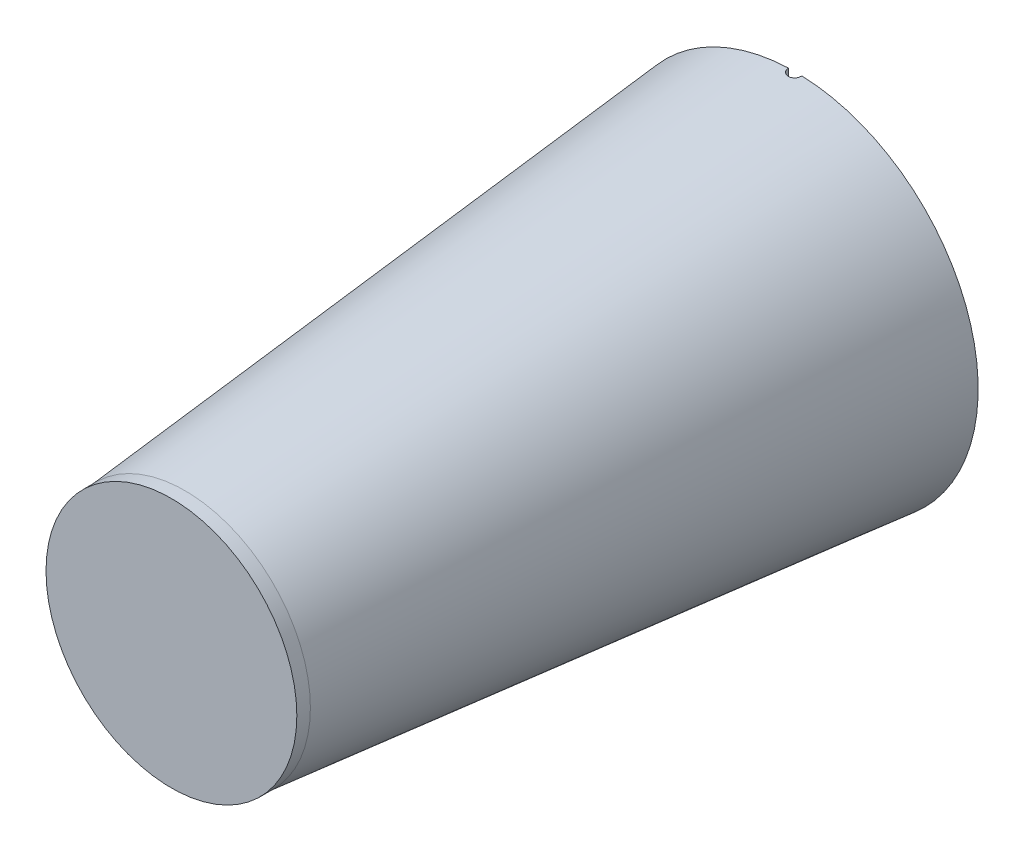
ISO-10303-21;
HEADER;
FILE_DESCRIPTION(('STEP AP214'),'2;1');
FILE_NAME('part.step','',(''),(''),'','','');
FILE_SCHEMA(('AUTOMOTIVE_DESIGN { 1 0 10303 214 1 1 1 1 }'));
ENDSEC;
DATA;
#1=APPLICATION_CONTEXT('core data for automotive mechanical design processes');
#2=APPLICATION_PROTOCOL_DEFINITION('international standard','automotive_design',2000,#1);
#3=PRODUCT_CONTEXT('',#1,'mechanical');
#4=PRODUCT('Part','Part','',(#3));
#5=PRODUCT_RELATED_PRODUCT_CATEGORY('part','',(#4));
#6=PRODUCT_DEFINITION_FORMATION('','',#4);
#7=PRODUCT_DEFINITION_CONTEXT('part definition',#1,'design');
#8=PRODUCT_DEFINITION('design','',#6,#7);
#9=PRODUCT_DEFINITION_SHAPE('','',#8);
#10=(LENGTH_UNIT() NAMED_UNIT(*) SI_UNIT(.MILLI.,.METRE.));
#11=(NAMED_UNIT(*) PLANE_ANGLE_UNIT() SI_UNIT($,.RADIAN.));
#12=(NAMED_UNIT(*) SI_UNIT($,.STERADIAN.) SOLID_ANGLE_UNIT());
#13=UNCERTAINTY_MEASURE_WITH_UNIT(LENGTH_MEASURE(1.E-05),#10,'distance_accuracy_value','');
#14=(GEOMETRIC_REPRESENTATION_CONTEXT(3) GLOBAL_UNCERTAINTY_ASSIGNED_CONTEXT((#13)) GLOBAL_UNIT_ASSIGNED_CONTEXT((#10,
#11,#12)) REPRESENTATION_CONTEXT('',''));
#15=CARTESIAN_POINT('',(0.,0.,0.));
#16=DIRECTION('',(0.,0.,1.));
#17=DIRECTION('',(1.,0.,0.));
#18=AXIS2_PLACEMENT_3D('',#15,#16,#17);
#19=CARTESIAN_POINT('',(0.,0.,-142.875));
#20=DIRECTION('',(0.,0.,-1.));
#21=DIRECTION('',(-1.,0.,0.));
#22=AXIS2_PLACEMENT_3D('',#19,#20,#21);
#23=PLANE('',#22);
#24=DIRECTION('',(0.,1.,0.));
#25=VECTOR('',#24,1.);
#26=CARTESIAN_POINT('',(-1.5875,-42.8625,-142.875));
#27=LINE('',#26,#25);
#28=CARTESIAN_POINT('',(-1.5875,-42.8330917632617,-142.875));
#29=VERTEX_POINT('',#28);
#30=CARTESIAN_POINT('',(-1.5875,-39.6415972973723,-142.875));
#31=VERTEX_POINT('',#30);
#32=EDGE_CURVE('E67',#29,#31,#27,.T.);
#33=ORIENTED_EDGE('',*,*,#32,.F.);
#34=CARTESIAN_POINT('',(0.,0.,-142.875));
#35=DIRECTION('',(0.,0.,1.));
#36=DIRECTION('',(1.,0.,0.));
#37=AXIS2_PLACEMENT_3D('',#34,#35,#36);
#38=CIRCLE('',#37,42.8625);
#39=CARTESIAN_POINT('',(-1.5875,42.8330917632617,-142.875));
#40=VERTEX_POINT('',#39);
#41=EDGE_CURVE('E110',#40,#29,#38,.T.);
#42=ORIENTED_EDGE('',*,*,#41,.F.);
#43=CARTESIAN_POINT('',(-1.5875,39.6415972973723,-142.875));
#44=VERTEX_POINT('',#43);
#45=EDGE_CURVE('E159',#44,#40,#27,.T.);
#46=ORIENTED_EDGE('',*,*,#45,.F.);
#47=CARTESIAN_POINT('',(0.,0.,-142.875));
#48=DIRECTION('',(0.,0.,-1.));
#49=DIRECTION('',(-1.,0.,0.));
#50=AXIS2_PLACEMENT_3D('',#47,#48,#49);
#51=CIRCLE('',#50,39.6733713280965);
#52=EDGE_CURVE('E101',#44,#31,#51,.F.);
#53=ORIENTED_EDGE('',*,*,#52,.T.);
#54=EDGE_LOOP('',(#33,#42,#46,#53));
#55=FACE_BOUND('',#54,.T.);
#56=ADVANCED_FACE('F39',(#55),#23,.T.);
#57=DIRECTION('',(0.,1.,0.));
#58=VECTOR('',#57,1.);
#59=CARTESIAN_POINT('',(1.5875,-42.8625,-142.875));
#60=LINE('',#59,#58);
#61=CARTESIAN_POINT('',(1.5875,42.8330917632617,-142.875));
#62=VERTEX_POINT('',#61);
#63=CARTESIAN_POINT('',(1.5875,39.6415972973723,-142.875));
#64=VERTEX_POINT('',#63);
#65=EDGE_CURVE('E60',#62,#64,#60,.F.);
#66=ORIENTED_EDGE('',*,*,#65,.F.);
#67=CARTESIAN_POINT('',(1.5875,-42.8330917632617,-142.875));
#68=VERTEX_POINT('',#67);
#69=EDGE_CURVE('E97',#68,#62,#38,.T.);
#70=ORIENTED_EDGE('',*,*,#69,.F.);
#71=CARTESIAN_POINT('',(1.5875,-39.6415972973723,-142.875));
#72=VERTEX_POINT('',#71);
#73=EDGE_CURVE('E84',#72,#68,#60,.F.);
#74=ORIENTED_EDGE('',*,*,#73,.F.);
#75=EDGE_CURVE('E95',#72,#64,#51,.F.);
#76=ORIENTED_EDGE('',*,*,#75,.T.);
#77=EDGE_LOOP('',(#66,#70,#74,#76));
#78=FACE_BOUND('',#77,.T.);
#79=ADVANCED_FACE('F94',(#78),#23,.T.);
#80=CARTESIAN_POINT('',(0.,0.,0.));
#81=DIRECTION('',(0.,0.,-1.));
#82=DIRECTION('',(-1.,0.,0.));
#83=AXIS2_PLACEMENT_3D('',#80,#81,#82);
#84=CONICAL_SURFACE('',#83,29.36875,0.0941651307315086);
#85=CARTESIAN_POINT('',(-1.58749998740157,42.8331106655862,-142.8752));
#86=CARTESIAN_POINT('',(-1.58750523012774,42.828886357014,-142.830509050695));
#87=CARTESIAN_POINT('',(-1.58562285524748,42.8247342089892,-142.785832351019));
#88=CARTESIAN_POINT('',(-1.57809810955712,42.8165963693619,-142.696782801359));
#89=CARTESIAN_POINT('',(-1.57245584084219,42.8126106732426,-142.652409943157));
#90=CARTESIAN_POINT('',(-1.54993374150302,42.8009474368018,-142.520284629854));
#91=CARTESIAN_POINT('',(-1.52745852880976,42.7935513421478,-142.433393939297));
#92=CARTESIAN_POINT('',(-1.46817652976476,42.7796714141653,-142.264562520417));
#93=CARTESIAN_POINT('',(-1.43136165872251,42.7731880982733,-142.182624614629));
#94=CARTESIAN_POINT('',(-1.34442773735409,42.7612157528768,-142.026071316838));
#95=CARTESIAN_POINT('',(-1.29431204429397,42.7557264730546,-141.951454083522));
#96=CARTESIAN_POINT('',(-1.18234109365005,42.7457825301732,-141.811886840149));
#97=CARTESIAN_POINT('',(-1.12051872117554,42.7413250448499,-141.74691063829));
#98=CARTESIAN_POINT('',(-0.986782564854913,42.7334108452505,-141.628240673933));
#99=CARTESIAN_POINT('',(-0.914867254608187,42.7299542825911,-141.574548621062));
#100=CARTESIAN_POINT('',(-0.76320204981943,42.7240138129684,-141.480139066153));
#101=CARTESIAN_POINT('',(-0.683473388789724,42.7215273565933,-141.439387609831));
#102=CARTESIAN_POINT('',(-0.518293172038839,42.7174704572667,-141.371840174881));
#103=CARTESIAN_POINT('',(-0.432842039635212,42.7158999466417,-141.345043165262));
#104=CARTESIAN_POINT('',(-0.258743193749283,42.713639782254,-141.306193391835));
#105=CARTESIAN_POINT('',(-0.17009924858501,42.7129491229507,-141.294123797427));
#106=CARTESIAN_POINT('',(0.00796195501444376,42.7124271456877,-141.285018826715));
#107=CARTESIAN_POINT('',(0.0973792294228409,42.7125958455206,-141.287983761694));
#108=CARTESIAN_POINT('',(0.274414392203447,42.7137970035256,-141.308859961838));
#109=CARTESIAN_POINT('',(0.362032887870679,42.7148291650978,-141.326766094682));
#110=CARTESIAN_POINT('',(0.533015235742462,42.7177829597541,-141.377004456242));
#111=CARTESIAN_POINT('',(0.616379107813528,42.7197045886846,-141.409336617591));
#112=CARTESIAN_POINT('',(0.77650203285072,42.7244781700279,-141.487505986083));
#113=CARTESIAN_POINT('',(0.853260006455482,42.7273302741109,-141.53334539483));
#114=CARTESIAN_POINT('',(0.997979897252285,42.7340073161811,-141.637209738739));
#115=CARTESIAN_POINT('',(1.06594222918803,42.7378322082727,-141.695234099001));
#116=CARTESIAN_POINT('',(1.19120020585015,42.7464870818696,-141.821845608604));
#117=CARTESIAN_POINT('',(1.24848894131026,42.7513177101575,-141.89043954776));
#118=CARTESIAN_POINT('',(1.35075674428447,42.7619845606573,-142.03622645502));
#119=CARTESIAN_POINT('',(1.39573191963846,42.7678210998773,-142.113422131201));
#120=CARTESIAN_POINT('',(1.47220130342403,42.7804678369598,-142.274379604137));
#121=CARTESIAN_POINT('',(1.50366032938254,42.7872805150431,-142.358157873604));
#122=CARTESIAN_POINT('',(1.55203644666943,42.8017622213251,-142.529669134062));
#123=CARTESIAN_POINT('',(1.5689748704347,42.8094299745257,-142.617396123666));
#124=CARTESIAN_POINT('',(1.58147576372836,42.8199832458339,-142.733940226308));
#125=CARTESIAN_POINT('',(1.58373941387484,42.8225679147232,-142.762174061979));
#126=CARTESIAN_POINT('',(1.58675123451369,42.8277957510361,-142.8186690317));
#127=CARTESIAN_POINT('',(1.5875019496103,42.8304388126649,-142.846930039798));
#128=CARTESIAN_POINT('',(1.58749998740158,42.8331106655862,-142.8752));
#129=B_SPLINE_CURVE_WITH_KNOTS('',3,(#85,#86,#87,#88,#89,#90,#91,#92,#93,#94,#95,#96,#97,#98,
#99,#100,#101,#102,#103,#104,#105,#106,#107,#108,#109,#110,#111,#112,#113,#114,#115,#116,#117,
#118,#119,#120,#121,#122,#123,#124,#125,#126,#127,#128),.UNSPECIFIED.,.F.,.F.,(4,2,2,2,2,2,2,2,
2,2,2,2,2,2,2,2,2,2,2,2,2,4),(0.,0.134588396192502,0.269173137956163,0.5379514062416,
0.806881431406118,1.07574364028206,1.34386150394152,1.61201996006066,1.87946887868224,
2.14689803468393,2.41402128355827,2.68115006313813,2.94818712141406,3.21522293267468,
3.48230229335931,3.74936905577344,4.01660810056086,4.28393151895261,4.55194662412295,
4.81956730613838,4.90486522751659,4.99001956625967),.UNSPECIFIED.);
#130=EDGE_CURVE('E138',#40,#62,#129,.T.);
#131=ORIENTED_EDGE('',*,*,#130,.F.);
#132=ORIENTED_EDGE('',*,*,#41,.T.);
#133=CARTESIAN_POINT('',(1.58749998740157,-42.8331106655862,-142.8752));
#134=CARTESIAN_POINT('',(1.58750523012774,-42.828886357014,-142.830509050695));
#135=CARTESIAN_POINT('',(1.58562285524748,-42.8247342089892,-142.785832351019));
#136=CARTESIAN_POINT('',(1.57809810955712,-42.8165963693619,-142.696782801359));
#137=CARTESIAN_POINT('',(1.57245584084219,-42.8126106732426,-142.652409943157));
#138=CARTESIAN_POINT('',(1.54993374150302,-42.8009474368018,-142.520284629854));
#139=CARTESIAN_POINT('',(1.52745852880976,-42.7935513421478,-142.433393939297));
#140=CARTESIAN_POINT('',(1.46817652976476,-42.7796714141653,-142.264562520417));
#141=CARTESIAN_POINT('',(1.43136165872251,-42.7731880982733,-142.182624614629));
#142=CARTESIAN_POINT('',(1.34442773735409,-42.7612157528768,-142.026071316838));
#143=CARTESIAN_POINT('',(1.29431204429397,-42.7557264730546,-141.951454083522));
#144=CARTESIAN_POINT('',(1.18234109365005,-42.7457825301732,-141.811886840149));
#145=CARTESIAN_POINT('',(1.12051872117554,-42.7413250448499,-141.74691063829));
#146=CARTESIAN_POINT('',(0.986782564854913,-42.7334108452505,-141.628240673933));
#147=CARTESIAN_POINT('',(0.914867254608187,-42.7299542825911,-141.574548621062));
#148=CARTESIAN_POINT('',(0.76320204981943,-42.7240138129684,-141.480139066153));
#149=CARTESIAN_POINT('',(0.683473388789724,-42.7215273565933,-141.439387609831));
#150=CARTESIAN_POINT('',(0.518293172038839,-42.7174704572667,-141.371840174881));
#151=CARTESIAN_POINT('',(0.432842039635212,-42.7158999466417,-141.345043165262));
#152=CARTESIAN_POINT('',(0.258743193749283,-42.713639782254,-141.306193391835));
#153=CARTESIAN_POINT('',(0.17009924858501,-42.7129491229507,-141.294123797427));
#154=CARTESIAN_POINT('',(-0.00796195501444376,-42.7124271456877,-141.285018826715));
#155=CARTESIAN_POINT('',(-0.0973792294228409,-42.7125958455206,-141.287983761694));
#156=CARTESIAN_POINT('',(-0.274414392203447,-42.7137970035256,-141.308859961838));
#157=CARTESIAN_POINT('',(-0.362032887870679,-42.7148291650978,-141.326766094682));
#158=CARTESIAN_POINT('',(-0.533015235742462,-42.7177829597541,-141.377004456242));
#159=CARTESIAN_POINT('',(-0.616379107813528,-42.7197045886846,-141.409336617591));
#160=CARTESIAN_POINT('',(-0.77650203285072,-42.7244781700279,-141.487505986083));
#161=CARTESIAN_POINT('',(-0.853260006455482,-42.7273302741109,-141.53334539483));
#162=CARTESIAN_POINT('',(-0.997979897252285,-42.7340073161811,-141.637209738739));
#163=CARTESIAN_POINT('',(-1.06594222918803,-42.7378322082727,-141.695234099001));
#164=CARTESIAN_POINT('',(-1.19120020585015,-42.7464870818696,-141.821845608604));
#165=CARTESIAN_POINT('',(-1.24848894131026,-42.7513177101575,-141.89043954776));
#166=CARTESIAN_POINT('',(-1.35075674428447,-42.7619845606573,-142.03622645502));
#167=CARTESIAN_POINT('',(-1.39573191963846,-42.7678210998773,-142.113422131201));
#168=CARTESIAN_POINT('',(-1.47220130342403,-42.7804678369598,-142.274379604137));
#169=CARTESIAN_POINT('',(-1.50366032938254,-42.7872805150431,-142.358157873604));
#170=CARTESIAN_POINT('',(-1.55203644666943,-42.8017622213251,-142.529669134062));
#171=CARTESIAN_POINT('',(-1.5689748704347,-42.8094299745257,-142.617396123666));
#172=CARTESIAN_POINT('',(-1.58147576372836,-42.8199832458339,-142.733940226308));
#173=CARTESIAN_POINT('',(-1.58373941387484,-42.8225679147232,-142.762174061979));
#174=CARTESIAN_POINT('',(-1.58675123451369,-42.8277957510361,-142.8186690317));
#175=CARTESIAN_POINT('',(-1.5875019496103,-42.8304388126649,-142.846930039798));
#176=CARTESIAN_POINT('',(-1.58749998740158,-42.8331106655862,-142.8752));
#177=B_SPLINE_CURVE_WITH_KNOTS('',3,(#133,#134,#135,#136,#137,#138,#139,#140,#141,#142,#143,
#144,#145,#146,#147,#148,#149,#150,#151,#152,#153,#154,#155,#156,#157,#158,#159,#160,#161,#162,
#163,#164,#165,#166,#167,#168,#169,#170,#171,#172,#173,#174,#175,#176),.UNSPECIFIED.,.F.,.F.,(4,
2,2,2,2,2,2,2,2,2,2,2,2,2,2,2,2,2,2,2,2,4),(0.,0.134588396192502,0.269173137956163,
0.5379514062416,0.806881431406118,1.07574364028206,1.34386150394152,1.61201996006066,
1.87946887868224,2.14689803468393,2.41402128355827,2.68115006313813,2.94818712141406,
3.21522293267468,3.48230229335931,3.74936905577344,4.01660810056086,4.28393151895261,
4.55194662412295,4.81956730613838,4.90486522751659,4.99001956625967),.UNSPECIFIED.);
#178=EDGE_CURVE('E131',#68,#29,#177,.T.);
#179=ORIENTED_EDGE('',*,*,#178,.F.);
#180=ORIENTED_EDGE('',*,*,#69,.T.);
#181=EDGE_LOOP('',(#131,#132,#179,#180));
#182=FACE_BOUND('',#181,.T.);
#183=CARTESIAN_POINT('',(0.,0.,0.));
#184=DIRECTION('',(0.,0.,1.));
#185=DIRECTION('',(1.,0.,0.));
#186=AXIS2_PLACEMENT_3D('',#183,#184,#185);
#187=CIRCLE('',#186,29.36875);
#188=CARTESIAN_POINT('',(29.36875,0.,0.));
#189=VERTEX_POINT('',#188);
#190=EDGE_CURVE('E100',#189,#189,#187,.T.);
#191=ORIENTED_EDGE('',*,*,#190,.F.);
#192=EDGE_LOOP('',(#191));
#193=FACE_BOUND('',#192,.T.);
#194=ADVANCED_FACE('F143',(#182,#193),#84,.T.);
#195=CARTESIAN_POINT('',(0.,0.,-0.298532648169858));
#196=DIRECTION('',(0.,0.,-1.));
#197=DIRECTION('',(-1.,0.,0.));
#198=AXIS2_PLACEMENT_3D('',#195,#196,#197);
#199=CONICAL_SURFACE('',#198,26.2078160782015,0.0941651307315086);
#200=CARTESIAN_POINT('',(0.,0.,-6.05146735183014));
#201=DIRECTION('',(0.,0.,-1.));
#202=DIRECTION('',(-1.,0.,0.));
#203=AXIS2_PLACEMENT_3D('',#200,#201,#202);
#204=CIRCLE('',#203,26.7511488002138);
#205=CARTESIAN_POINT('',(-26.7511488002138,0.,-6.05146735183014));
#206=VERTEX_POINT('',#205);
#207=EDGE_CURVE('E111',#206,#206,#204,.F.);
#208=ORIENTED_EDGE('',*,*,#207,.T.);
#209=EDGE_LOOP('',(#208));
#210=FACE_BOUND('',#209,.T.);
#211=ORIENTED_EDGE('',*,*,#52,.F.);
#212=CARTESIAN_POINT('',(-1.58749998740157,39.6416162019057,-142.8752));
#213=CARTESIAN_POINT('',(-1.58750523155981,39.6373923843337,-142.830519886578));
#214=CARTESIAN_POINT('',(-1.58562376640373,39.6332463390963,-142.785853467951));
#215=CARTESIAN_POINT('',(-1.5781024042293,39.6251316336399,-142.696823287385));
#216=CARTESIAN_POINT('',(-1.57246260646126,39.6211629687397,-142.652459517484));
#217=CARTESIAN_POINT('',(-1.54994989361618,39.6095667289363,-142.520359721854));
#218=CARTESIAN_POINT('',(-1.52748357152034,39.6022364971376,-142.433483652885));
#219=CARTESIAN_POINT('',(-1.46822308897507,39.5885237237152,-142.264676711437));
#220=CARTESIAN_POINT('',(-1.43142079386858,39.5821417229913,-142.182748677161));
#221=CARTESIAN_POINT('',(-1.34451526252475,39.5703962037034,-142.026211409706));
#222=CARTESIAN_POINT('',(-1.29441539334066,39.5650324279056,-141.951600330355));
#223=CARTESIAN_POINT('',(-1.18248085501041,39.5553493070006,-141.812043702744));
#224=CARTESIAN_POINT('',(-1.12067939731107,39.5510270828133,-141.747071705793));
#225=CARTESIAN_POINT('',(-0.986988681603991,39.5433779939926,-141.628405127533));
#226=CARTESIAN_POINT('',(-0.915097885258056,39.5400512813892,-141.574712269096));
#227=CARTESIAN_POINT('',(-0.763472741908467,39.5343494635386,-141.480287601532));
#228=CARTESIAN_POINT('',(-0.683758387689388,39.5319720075211,-141.439523826583));
#229=CARTESIAN_POINT('',(-0.518606515495386,39.5281006541305,-141.371948712314));
#230=CARTESIAN_POINT('',(-0.433169415849235,39.5266066922529,-141.345136354409));
#231=CARTESIAN_POINT('',(-0.259081101286275,39.5244580400344,-141.306248756865));
#232=CARTESIAN_POINT('',(-0.170433052839378,39.5238025448298,-141.294159384824));
#233=CARTESIAN_POINT('',(0.00763936458581877,39.523305791759,-141.285016871246));
#234=CARTESIAN_POINT('',(0.0970637501602633,39.5234645513425,-141.287964051947));
#235=CARTESIAN_POINT('',(0.274124136835986,39.5246017790338,-141.308808307515));
#236=CARTESIAN_POINT('',(0.361760590266842,39.5255800371148,-141.326701551895));
#237=CARTESIAN_POINT('',(0.532781089383698,39.5283881537255,-141.376920240566));
#238=CARTESIAN_POINT('',(0.616165155129389,39.5302180082375,-141.409245616769));
#239=CARTESIAN_POINT('',(0.776326225668051,39.5347804990306,-141.487406743259));
#240=CARTESIAN_POINT('',(0.853102417225541,39.5375132462316,-141.533244153417));
#241=CARTESIAN_POINT('',(0.997858577800242,39.5439376667853,-141.637110833227));
#242=CARTESIAN_POINT('',(1.06583896745686,39.5476292942564,-141.69513951951));
#243=CARTESIAN_POINT('',(1.19112101835926,39.556018148214,-141.821755775144));
#244=CARTESIAN_POINT('',(1.24841744007788,39.5607158656837,-141.890348495256));
#245=CARTESIAN_POINT('',(1.35070021567514,39.5711327575206,-142.036135008783));
#246=CARTESIAN_POINT('',(1.39568270270711,39.5768522518185,-142.113331493286));
#247=CARTESIAN_POINT('',(1.47215824176671,39.5892924031434,-142.27427598189));
#248=CARTESIAN_POINT('',(1.50361868067979,39.5960154285509,-142.358039255683));
#249=CARTESIAN_POINT('',(1.55200205219622,39.6103564258008,-142.529518286788));
#250=CARTESIAN_POINT('',(1.56894627658885,39.6179730682003,-142.617228055957));
#251=CARTESIAN_POINT('',(1.58146247766648,39.628491055106,-142.733784940757));
#252=CARTESIAN_POINT('',(1.5837311340552,39.6310720443638,-142.762050026406));
#253=CARTESIAN_POINT('',(1.58674959438344,39.6362971359078,-142.818607240922));
#254=CARTESIAN_POINT('',(1.58750195151048,39.6389411245033,-142.846899243941));
#255=CARTESIAN_POINT('',(1.58749998740158,39.6416162019057,-142.8752));
#256=B_SPLINE_CURVE_WITH_KNOTS('',3,(#212,#213,#214,#215,#216,#217,#218,#219,#220,#221,#222,
#223,#224,#225,#226,#227,#228,#229,#230,#231,#232,#233,#234,#235,#236,#237,#238,#239,#240,#241,
#242,#243,#244,#245,#246,#247,#248,#249,#250,#251,#252,#253,#254,#255),.UNSPECIFIED.,.F.,.F.,(4,
2,2,2,2,2,2,2,2,2,2,2,2,2,2,2,2,2,2,2,2,4),(0.,0.134555949455836,0.269108345689636,
0.537821742509772,0.806687837924349,1.07548591910911,1.34353223314547,1.6116194611396,
1.87903860890108,2.14643822979461,2.41358097446259,2.68072944410603,2.94780946798863,
3.21488823186421,3.48199981843935,3.74909862627951,4.01632807957651,4.28364135279602,
4.55159577552336,4.81915649746612,4.90454755430616,4.98979470673913),.UNSPECIFIED.);
#257=EDGE_CURVE('E11',#44,#64,#256,.T.);
#258=ORIENTED_EDGE('',*,*,#257,.T.);
#259=ORIENTED_EDGE('',*,*,#75,.F.);
#260=CARTESIAN_POINT('',(1.58749998740157,-39.6416162019057,-142.8752));
#261=CARTESIAN_POINT('',(1.58750523155981,-39.6373923843337,-142.830519886578));
#262=CARTESIAN_POINT('',(1.58562376640373,-39.6332463390963,-142.785853467951));
#263=CARTESIAN_POINT('',(1.5781024042293,-39.6251316336399,-142.696823287385));
#264=CARTESIAN_POINT('',(1.57246260646126,-39.6211629687397,-142.652459517484));
#265=CARTESIAN_POINT('',(1.54994989361618,-39.6095667289363,-142.520359721854));
#266=CARTESIAN_POINT('',(1.52748357152034,-39.6022364971376,-142.433483652885));
#267=CARTESIAN_POINT('',(1.46822308897507,-39.5885237237152,-142.264676711437));
#268=CARTESIAN_POINT('',(1.43142079386858,-39.5821417229913,-142.182748677161));
#269=CARTESIAN_POINT('',(1.34451526252475,-39.5703962037034,-142.026211409706));
#270=CARTESIAN_POINT('',(1.29441539334066,-39.5650324279056,-141.951600330355));
#271=CARTESIAN_POINT('',(1.18248085501041,-39.5553493070006,-141.812043702744));
#272=CARTESIAN_POINT('',(1.12067939731107,-39.5510270828133,-141.747071705793));
#273=CARTESIAN_POINT('',(0.986988681603991,-39.5433779939926,-141.628405127533));
#274=CARTESIAN_POINT('',(0.915097885258056,-39.5400512813892,-141.574712269096));
#275=CARTESIAN_POINT('',(0.763472741908467,-39.5343494635386,-141.480287601532));
#276=CARTESIAN_POINT('',(0.683758387689388,-39.5319720075211,-141.439523826583));
#277=CARTESIAN_POINT('',(0.518606515495386,-39.5281006541305,-141.371948712314));
#278=CARTESIAN_POINT('',(0.433169415849235,-39.5266066922529,-141.345136354409));
#279=CARTESIAN_POINT('',(0.259081101286275,-39.5244580400344,-141.306248756865));
#280=CARTESIAN_POINT('',(0.170433052839378,-39.5238025448298,-141.294159384824));
#281=CARTESIAN_POINT('',(-0.00763936458581877,-39.523305791759,-141.285016871246));
#282=CARTESIAN_POINT('',(-0.0970637501602633,-39.5234645513425,-141.287964051947));
#283=CARTESIAN_POINT('',(-0.274124136835986,-39.5246017790338,-141.308808307515));
#284=CARTESIAN_POINT('',(-0.361760590266842,-39.5255800371148,-141.326701551895));
#285=CARTESIAN_POINT('',(-0.532781089383698,-39.5283881537255,-141.376920240566));
#286=CARTESIAN_POINT('',(-0.616165155129389,-39.5302180082375,-141.409245616769));
#287=CARTESIAN_POINT('',(-0.776326225668051,-39.5347804990306,-141.487406743259));
#288=CARTESIAN_POINT('',(-0.853102417225541,-39.5375132462316,-141.533244153417));
#289=CARTESIAN_POINT('',(-0.997858577800242,-39.5439376667853,-141.637110833227));
#290=CARTESIAN_POINT('',(-1.06583896745686,-39.5476292942564,-141.69513951951));
#291=CARTESIAN_POINT('',(-1.19112101835926,-39.556018148214,-141.821755775144));
#292=CARTESIAN_POINT('',(-1.24841744007788,-39.5607158656837,-141.890348495256));
#293=CARTESIAN_POINT('',(-1.35070021567514,-39.5711327575206,-142.036135008783));
#294=CARTESIAN_POINT('',(-1.39568270270711,-39.5768522518185,-142.113331493286));
#295=CARTESIAN_POINT('',(-1.47215824176671,-39.5892924031434,-142.27427598189));
#296=CARTESIAN_POINT('',(-1.50361868067979,-39.5960154285509,-142.358039255683));
#297=CARTESIAN_POINT('',(-1.55200205219622,-39.6103564258008,-142.529518286788));
#298=CARTESIAN_POINT('',(-1.56894627658885,-39.6179730682003,-142.617228055957));
#299=CARTESIAN_POINT('',(-1.58146247766648,-39.628491055106,-142.733784940757));
#300=CARTESIAN_POINT('',(-1.5837311340552,-39.6310720443638,-142.762050026406));
#301=CARTESIAN_POINT('',(-1.58674959438344,-39.6362971359078,-142.818607240922));
#302=CARTESIAN_POINT('',(-1.58750195151048,-39.6389411245033,-142.846899243941));
#303=CARTESIAN_POINT('',(-1.58749998740158,-39.6416162019057,-142.8752));
#304=B_SPLINE_CURVE_WITH_KNOTS('',3,(#260,#261,#262,#263,#264,#265,#266,#267,#268,#269,#270,
#271,#272,#273,#274,#275,#276,#277,#278,#279,#280,#281,#282,#283,#284,#285,#286,#287,#288,#289,
#290,#291,#292,#293,#294,#295,#296,#297,#298,#299,#300,#301,#302,#303),.UNSPECIFIED.,.F.,.F.,(4,
2,2,2,2,2,2,2,2,2,2,2,2,2,2,2,2,2,2,2,2,4),(0.,0.134555949455836,0.269108345689636,
0.537821742509772,0.806687837924349,1.07548591910911,1.34353223314547,1.6116194611396,
1.87903860890108,2.14643822979461,2.41358097446259,2.68072944410603,2.94780946798863,
3.21488823186421,3.48199981843935,3.74909862627951,4.01632807957651,4.28364135279602,
4.55159577552336,4.81915649746612,4.90454755430616,4.98979470673913),.UNSPECIFIED.);
#305=EDGE_CURVE('E53',#72,#31,#304,.T.);
#306=ORIENTED_EDGE('',*,*,#305,.T.);
#307=EDGE_LOOP('',(#211,#258,#259,#306));
#308=FACE_BOUND('',#307,.T.);
#309=ADVANCED_FACE('F99',(#210,#308),#199,.F.);
#310=CARTESIAN_POINT('',(29.36875,0.,-3.175));
#311=DIRECTION('',(0.,0.,1.));
#312=DIRECTION('',(1.,0.,0.));
#313=AXIS2_PLACEMENT_3D('',#310,#311,#312);
#314=PLANE('',#313);
#315=CARTESIAN_POINT('',(0.,0.,-3.175));
#316=DIRECTION('',(0.,0.,1.));
#317=DIRECTION('',(1.,0.,0.));
#318=AXIS2_PLACEMENT_3D('',#315,#316,#317);
#319=CIRCLE('',#318,23.5902148784153);
#320=CARTESIAN_POINT('',(23.5902148784153,0.,-3.175));
#321=VERTEX_POINT('',#320);
#322=EDGE_CURVE('E90',#321,#321,#319,.F.);
#323=ORIENTED_EDGE('',*,*,#322,.T.);
#324=EDGE_LOOP('',(#323));
#325=FACE_BOUND('',#324,.T.);
#326=ADVANCED_FACE('F147',(#325),#314,.F.);
#327=CARTESIAN_POINT('',(0.,0.,3.175));
#328=DIRECTION('',(0.,0.,-1.));
#329=DIRECTION('',(-1.,0.,0.));
#330=AXIS2_PLACEMENT_3D('',#327,#328,#329);
#331=CYLINDRICAL_SURFACE('',#330,29.36875);
#332=CARTESIAN_POINT('',(0.,0.,3.175));
#333=DIRECTION('',(0.,0.,1.));
#334=DIRECTION('',(1.,0.,0.));
#335=AXIS2_PLACEMENT_3D('',#332,#333,#334);
#336=CIRCLE('',#335,29.36875);
#337=CARTESIAN_POINT('',(29.36875,0.,3.175));
#338=VERTEX_POINT('',#337);
#339=EDGE_CURVE('E105',#338,#338,#336,.T.);
#340=ORIENTED_EDGE('',*,*,#339,.F.);
#341=EDGE_LOOP('',(#340));
#342=FACE_BOUND('',#341,.T.);
#343=ORIENTED_EDGE('',*,*,#190,.T.);
#344=EDGE_LOOP('',(#343));
#345=FACE_BOUND('',#344,.T.);
#346=ADVANCED_FACE('F184',(#342,#345),#331,.T.);
#347=CARTESIAN_POINT('',(0.,0.,3.175));
#348=DIRECTION('',(0.,0.,1.));
#349=DIRECTION('',(1.,0.,0.));
#350=AXIS2_PLACEMENT_3D('',#347,#348,#349);
#351=PLANE('',#350);
#352=ORIENTED_EDGE('',*,*,#339,.T.);
#353=EDGE_LOOP('',(#352));
#354=FACE_BOUND('',#353,.T.);
#355=ADVANCED_FACE('F126',(#354),#351,.T.);
#356=CARTESIAN_POINT('',(0.,0.,-6.35));
#357=DIRECTION('',(0.,0.,1.));
#358=DIRECTION('',(1.,0.,0.));
#359=AXIS2_PLACEMENT_3D('',#356,#357,#358);
#360=TOROIDAL_SURFACE('',#359,23.5902148784153,3.175);
#361=ORIENTED_EDGE('',*,*,#322,.F.);
#362=EDGE_LOOP('',(#361));
#363=FACE_BOUND('',#362,.T.);
#364=ORIENTED_EDGE('',*,*,#207,.F.);
#365=EDGE_LOOP('',(#364));
#366=FACE_BOUND('',#365,.T.);
#367=ADVANCED_FACE('F41',(#363,#366),#360,.F.);
#368=CARTESIAN_POINT('',(0.,-42.8625,-142.875));
#369=DIRECTION('',(0.,1.,0.));
#370=DIRECTION('',(0.,0.,1.));
#371=AXIS2_PLACEMENT_3D('',#368,#369,#370);
#372=CYLINDRICAL_SURFACE('',#371,1.5875);
#373=ORIENTED_EDGE('',*,*,#178,.T.);
#374=ORIENTED_EDGE('',*,*,#32,.T.);
#375=ORIENTED_EDGE('',*,*,#305,.F.);
#376=ORIENTED_EDGE('',*,*,#73,.T.);
#377=EDGE_LOOP('',(#373,#374,#375,#376));
#378=FACE_BOUND('',#377,.T.);
#379=ADVANCED_FACE('F83',(#378),#372,.F.);
#380=ORIENTED_EDGE('',*,*,#130,.T.);
#381=ORIENTED_EDGE('',*,*,#65,.T.);
#382=ORIENTED_EDGE('',*,*,#257,.F.);
#383=ORIENTED_EDGE('',*,*,#45,.T.);
#384=EDGE_LOOP('',(#380,#381,#382,#383));
#385=FACE_BOUND('',#384,.T.);
#386=ADVANCED_FACE('F125',(#385),#372,.F.);
#387=CLOSED_SHELL('',(#56,#79,#194,#309,#326,#346,#355,#367,#379,#386));
#388=MANIFOLD_SOLID_BREP('B2',#387);
#389=ADVANCED_BREP_SHAPE_REPRESENTATION('',(#18,#388),#14);
#390=SHAPE_DEFINITION_REPRESENTATION(#9,#389);
ENDSEC;
END-ISO-10303-21;
